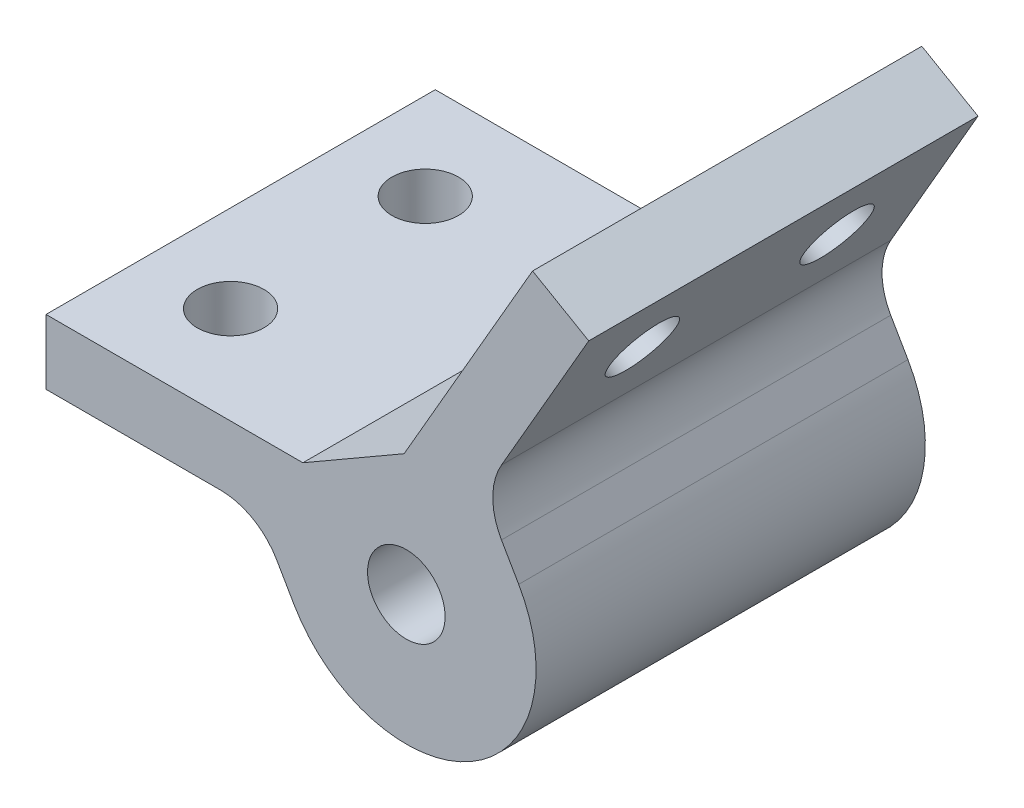
ISO-10303-21;
HEADER;
FILE_DESCRIPTION(('STEP AP214'),'2;1');
FILE_NAME('part.step','',(''),(''),'','','');
FILE_SCHEMA(('AUTOMOTIVE_DESIGN { 1 0 10303 214 1 1 1 1 }'));
ENDSEC;
DATA;
#1=APPLICATION_CONTEXT('core data for automotive mechanical design processes');
#2=APPLICATION_PROTOCOL_DEFINITION('international standard','automotive_design',2000,#1);
#3=PRODUCT_CONTEXT('',#1,'mechanical');
#4=PRODUCT('Part','Part','',(#3));
#5=PRODUCT_RELATED_PRODUCT_CATEGORY('part','',(#4));
#6=PRODUCT_DEFINITION_FORMATION('','',#4);
#7=PRODUCT_DEFINITION_CONTEXT('part definition',#1,'design');
#8=PRODUCT_DEFINITION('design','',#6,#7);
#9=PRODUCT_DEFINITION_SHAPE('','',#8);
#10=(LENGTH_UNIT() NAMED_UNIT(*) SI_UNIT(.MILLI.,.METRE.));
#11=(NAMED_UNIT(*) PLANE_ANGLE_UNIT() SI_UNIT($,.RADIAN.));
#12=(NAMED_UNIT(*) SI_UNIT($,.STERADIAN.) SOLID_ANGLE_UNIT());
#13=UNCERTAINTY_MEASURE_WITH_UNIT(LENGTH_MEASURE(1.E-05),#10,'distance_accuracy_value','');
#14=(GEOMETRIC_REPRESENTATION_CONTEXT(3) GLOBAL_UNCERTAINTY_ASSIGNED_CONTEXT((#13)) GLOBAL_UNIT_ASSIGNED_CONTEXT((#10,
#11,#12)) REPRESENTATION_CONTEXT('',''));
#15=CARTESIAN_POINT('',(0.,0.,0.));
#16=DIRECTION('',(0.,0.,1.));
#17=DIRECTION('',(1.,0.,0.));
#18=AXIS2_PLACEMENT_3D('',#15,#16,#17);
#19=CARTESIAN_POINT('',(-0.108763620489994,5.90761588329622,19.05));
#20=DIRECTION('',(0.500000000000001,-0.866025403784438,0.));
#21=DIRECTION('',(0.866025403784438,0.500000000000001,0.));
#22=AXIS2_PLACEMENT_3D('',#19,#20,#21);
#23=PLANE('',#22);
#24=DIRECTION('',(-0.866025403784438,-0.500000000000001,0.));
#25=VECTOR('',#24,1.);
#26=CARTESIAN_POINT('',(-0.108763620489994,5.90761588329622,0.));
#27=LINE('',#26,#25);
#28=CARTESIAN_POINT('',(-0.108763620489994,5.90761588329622,0.));
#29=VERTEX_POINT('',#28);
#30=CARTESIAN_POINT('',(-5.06176362048999,3.048,0.));
#31=VERTEX_POINT('',#30);
#32=EDGE_CURVE('E146',#29,#31,#27,.T.);
#33=ORIENTED_EDGE('',*,*,#32,.T.);
#34=DIRECTION('',(0.,0.,-1.));
#35=VECTOR('',#34,1.);
#36=CARTESIAN_POINT('',(-5.06176362048999,3.048,19.05));
#37=LINE('',#36,#35);
#38=CARTESIAN_POINT('',(-5.06176362048999,3.048,19.05));
#39=VERTEX_POINT('',#38);
#40=EDGE_CURVE('E127',#39,#31,#37,.T.);
#41=ORIENTED_EDGE('',*,*,#40,.F.);
#42=DIRECTION('',(-0.866025403784438,-0.500000000000001,0.));
#43=VECTOR('',#42,1.);
#44=CARTESIAN_POINT('',(-0.108763620489994,5.90761588329622,19.05));
#45=LINE('',#44,#43);
#46=CARTESIAN_POINT('',(-0.108763620489994,5.90761588329622,19.05));
#47=VERTEX_POINT('',#46);
#48=EDGE_CURVE('E134',#47,#39,#45,.T.);
#49=ORIENTED_EDGE('',*,*,#48,.F.);
#50=DIRECTION('',(0.,0.,-1.));
#51=VECTOR('',#50,1.);
#52=CARTESIAN_POINT('',(-0.108763620489994,5.90761588329622,19.05));
#53=LINE('',#52,#51);
#54=EDGE_CURVE('E211',#47,#29,#53,.T.);
#55=ORIENTED_EDGE('',*,*,#54,.T.);
#56=EDGE_LOOP('',(#33,#41,#49,#55));
#57=FACE_BOUND('',#56,.T.);
#58=ADVANCED_FACE('F33',(#57),#23,.F.);
#59=CARTESIAN_POINT('',(-5.06176362048999,3.048,19.05));
#60=DIRECTION('',(0.,-1.,0.));
#61=DIRECTION('',(1.,0.,0.));
#62=AXIS2_PLACEMENT_3D('',#59,#60,#61);
#63=PLANE('',#62);
#64=CARTESIAN_POINT('',(-13.3634378298441,3.048,4.7625));
#65=DIRECTION('',(0.,-1.,0.));
#66=DIRECTION('',(1.,0.,0.));
#67=AXIS2_PLACEMENT_3D('',#64,#65,#66);
#68=CIRCLE('',#67,1.63194999999999);
#69=CARTESIAN_POINT('',(-11.7314878298441,3.048,4.7625));
#70=VERTEX_POINT('',#69);
#71=EDGE_CURVE('E269',#70,#70,#68,.T.);
#72=ORIENTED_EDGE('',*,*,#71,.T.);
#73=EDGE_LOOP('',(#72));
#74=FACE_BOUND('',#73,.T.);
#75=CARTESIAN_POINT('',(-13.3634378298441,3.048,14.2875));
#76=DIRECTION('',(0.,-1.,0.));
#77=DIRECTION('',(1.,0.,0.));
#78=AXIS2_PLACEMENT_3D('',#75,#76,#77);
#79=CIRCLE('',#78,1.63194999999999);
#80=CARTESIAN_POINT('',(-11.7314878298441,3.048,14.2875));
#81=VERTEX_POINT('',#80);
#82=EDGE_CURVE('E37',#81,#81,#79,.T.);
#83=ORIENTED_EDGE('',*,*,#82,.T.);
#84=EDGE_LOOP('',(#83));
#85=FACE_BOUND('',#84,.T.);
#86=DIRECTION('',(-1.,0.,0.));
#87=VECTOR('',#86,1.);
#88=CARTESIAN_POINT('',(-5.06176362048999,3.048,0.));
#89=LINE('',#88,#87);
#90=CARTESIAN_POINT('',(-17.63476362049,3.048,0.));
#91=VERTEX_POINT('',#90);
#92=EDGE_CURVE('E199',#31,#91,#89,.T.);
#93=ORIENTED_EDGE('',*,*,#92,.T.);
#94=DIRECTION('',(0.,0.,-1.));
#95=VECTOR('',#94,1.);
#96=CARTESIAN_POINT('',(-17.63476362049,3.048,19.05));
#97=LINE('',#96,#95);
#98=CARTESIAN_POINT('',(-17.63476362049,3.048,19.05));
#99=VERTEX_POINT('',#98);
#100=EDGE_CURVE('E130',#99,#91,#97,.T.);
#101=ORIENTED_EDGE('',*,*,#100,.F.);
#102=DIRECTION('',(-1.,0.,0.));
#103=VECTOR('',#102,1.);
#104=CARTESIAN_POINT('',(-5.06176362048999,3.048,19.05));
#105=LINE('',#104,#103);
#106=EDGE_CURVE('E123',#39,#99,#105,.T.);
#107=ORIENTED_EDGE('',*,*,#106,.F.);
#108=ORIENTED_EDGE('',*,*,#40,.T.);
#109=EDGE_LOOP('',(#93,#101,#107,#108));
#110=FACE_BOUND('',#109,.T.);
#111=ADVANCED_FACE('F125',(#74,#85,#110),#63,.F.);
#112=CARTESIAN_POINT('',(-17.63476362049,3.048,19.05));
#113=DIRECTION('',(1.,0.,0.));
#114=DIRECTION('',(0.,0.,-1.));
#115=AXIS2_PLACEMENT_3D('',#112,#113,#114);
#116=PLANE('',#115);
#117=DIRECTION('',(0.,-1.,0.));
#118=VECTOR('',#117,1.);
#119=CARTESIAN_POINT('',(-17.63476362049,3.048,0.));
#120=LINE('',#119,#118);
#121=CARTESIAN_POINT('',(-17.63476362049,-0.127000000000002,0.));
#122=VERTEX_POINT('',#121);
#123=EDGE_CURVE('E195',#91,#122,#120,.T.);
#124=ORIENTED_EDGE('',*,*,#123,.T.);
#125=DIRECTION('',(0.,0.,-1.));
#126=VECTOR('',#125,1.);
#127=CARTESIAN_POINT('',(-17.63476362049,-0.127000000000002,19.05));
#128=LINE('',#127,#126);
#129=CARTESIAN_POINT('',(-17.63476362049,-0.127000000000002,19.05));
#130=VERTEX_POINT('',#129);
#131=EDGE_CURVE('E152',#130,#122,#128,.T.);
#132=ORIENTED_EDGE('',*,*,#131,.F.);
#133=DIRECTION('',(0.,-1.,0.));
#134=VECTOR('',#133,1.);
#135=CARTESIAN_POINT('',(-17.63476362049,3.048,19.05));
#136=LINE('',#135,#134);
#137=EDGE_CURVE('E133',#99,#130,#136,.T.);
#138=ORIENTED_EDGE('',*,*,#137,.F.);
#139=ORIENTED_EDGE('',*,*,#100,.T.);
#140=EDGE_LOOP('',(#124,#132,#138,#139));
#141=FACE_BOUND('',#140,.T.);
#142=ADVANCED_FACE('F245',(#141),#116,.F.);
#143=CARTESIAN_POINT('',(-17.63476362049,-0.127000000000002,19.05));
#144=DIRECTION('',(0.,1.,0.));
#145=DIRECTION('',(-1.,0.,0.));
#146=AXIS2_PLACEMENT_3D('',#143,#144,#145);
#147=PLANE('',#146);
#148=CARTESIAN_POINT('',(-13.3634378298441,-0.127000000000003,4.7625));
#149=DIRECTION('',(0.,-1.,0.));
#150=DIRECTION('',(0.,0.,-1.));
#151=AXIS2_PLACEMENT_3D('',#148,#149,#150);
#152=CIRCLE('',#151,1.63194999999999);
#153=CARTESIAN_POINT('',(-13.3634378298441,-0.127000000000003,3.13055000000001));
#154=VERTEX_POINT('',#153);
#155=EDGE_CURVE('E272',#154,#154,#152,.T.);
#156=ORIENTED_EDGE('',*,*,#155,.F.);
#157=EDGE_LOOP('',(#156));
#158=FACE_BOUND('',#157,.T.);
#159=CARTESIAN_POINT('',(-13.3634378298441,-0.127000000000003,14.2875));
#160=DIRECTION('',(0.,-1.,0.));
#161=DIRECTION('',(0.,0.,-1.));
#162=AXIS2_PLACEMENT_3D('',#159,#160,#161);
#163=CIRCLE('',#162,1.63194999999999);
#164=CARTESIAN_POINT('',(-13.3634378298441,-0.127000000000003,12.65555));
#165=VERTEX_POINT('',#164);
#166=EDGE_CURVE('E266',#165,#165,#163,.T.);
#167=ORIENTED_EDGE('',*,*,#166,.F.);
#168=EDGE_LOOP('',(#167));
#169=FACE_BOUND('',#168,.T.);
#170=DIRECTION('',(1.,0.,0.));
#171=VECTOR('',#170,1.);
#172=CARTESIAN_POINT('',(-17.63476362049,-0.127000000000002,0.));
#173=LINE('',#172,#171);
#174=CARTESIAN_POINT('',(-9.09211203919823,-0.127000000000001,0.));
#175=VERTEX_POINT('',#174);
#176=EDGE_CURVE('E188',#122,#175,#173,.T.);
#177=ORIENTED_EDGE('',*,*,#176,.T.);
#178=DIRECTION('',(0.,0.,-1.));
#179=VECTOR('',#178,1.);
#180=CARTESIAN_POINT('',(-9.09211203919823,-0.127000000000001,19.05));
#181=LINE('',#180,#179);
#182=CARTESIAN_POINT('',(-9.09211203919823,-0.127000000000001,19.05));
#183=VERTEX_POINT('',#182);
#184=EDGE_CURVE('E150',#175,#183,#181,.F.);
#185=ORIENTED_EDGE('',*,*,#184,.T.);
#186=DIRECTION('',(1.,0.,0.));
#187=VECTOR('',#186,1.);
#188=CARTESIAN_POINT('',(-17.63476362049,-0.127000000000002,19.05));
#189=LINE('',#188,#187);
#190=EDGE_CURVE('E171',#130,#183,#189,.T.);
#191=ORIENTED_EDGE('',*,*,#190,.F.);
#192=ORIENTED_EDGE('',*,*,#131,.T.);
#193=EDGE_LOOP('',(#177,#185,#191,#192));
#194=FACE_BOUND('',#193,.T.);
#195=ADVANCED_FACE('F193',(#158,#169,#194),#147,.F.);
#196=CARTESIAN_POINT('',(-5.49926131403118,-3.17500000000001,19.05));
#197=DIRECTION('',(0.866025403784438,0.500000000000001,0.));
#198=DIRECTION('',(-0.500000000000001,0.866025403784438,0.));
#199=AXIS2_PLACEMENT_3D('',#196,#197,#198);
#200=PLANE('',#199);
#201=DIRECTION('',(0.500000000000001,-0.866025403784438,0.));
#202=VECTOR('',#201,1.);
#203=CARTESIAN_POINT('',(-5.49926131403118,-3.17500000000001,19.05));
#204=LINE('',#203,#202);
#205=CARTESIAN_POINT('',(-6.34248138218264,-1.7145,19.05));
#206=VERTEX_POINT('',#205);
#207=CARTESIAN_POINT('',(-5.49926131403118,-3.17500000000001,19.05));
#208=VERTEX_POINT('',#207);
#209=EDGE_CURVE('E168',#206,#208,#204,.T.);
#210=ORIENTED_EDGE('',*,*,#209,.F.);
#211=DIRECTION('',(0.,0.,-1.));
#212=VECTOR('',#211,1.);
#213=CARTESIAN_POINT('',(-6.34248138218264,-1.7145,0.));
#214=LINE('',#213,#212);
#215=CARTESIAN_POINT('',(-6.34248138218264,-1.7145,0.));
#216=VERTEX_POINT('',#215);
#217=EDGE_CURVE('E147',#206,#216,#214,.T.);
#218=ORIENTED_EDGE('',*,*,#217,.T.);
#219=DIRECTION('',(0.500000000000001,-0.866025403784438,0.));
#220=VECTOR('',#219,1.);
#221=CARTESIAN_POINT('',(-5.49926131403118,-3.17500000000001,0.));
#222=LINE('',#221,#220);
#223=CARTESIAN_POINT('',(-5.49926131403118,-3.17500000000001,0.));
#224=VERTEX_POINT('',#223);
#225=EDGE_CURVE('E190',#216,#224,#222,.T.);
#226=ORIENTED_EDGE('',*,*,#225,.T.);
#227=DIRECTION('',(0.,0.,-1.));
#228=VECTOR('',#227,1.);
#229=CARTESIAN_POINT('',(-5.49926131403118,-3.17500000000001,19.05));
#230=LINE('',#229,#228);
#231=EDGE_CURVE('E179',#208,#224,#230,.T.);
#232=ORIENTED_EDGE('',*,*,#231,.F.);
#233=EDGE_LOOP('',(#210,#218,#226,#232));
#234=FACE_BOUND('',#233,.T.);
#235=ADVANCED_FACE('F176',(#234),#200,.F.);
#236=CARTESIAN_POINT('',(0.,0.,19.05));
#237=DIRECTION('',(0.,0.,-1.));
#238=DIRECTION('',(-1.,0.,0.));
#239=AXIS2_PLACEMENT_3D('',#236,#237,#238);
#240=CYLINDRICAL_SURFACE('',#239,6.35);
#241=CARTESIAN_POINT('',(0.,0.,0.));
#242=DIRECTION('',(0.,0.,1.));
#243=DIRECTION('',(1.,0.,0.));
#244=AXIS2_PLACEMENT_3D('',#241,#242,#243);
#245=CIRCLE('',#244,6.35);
#246=CARTESIAN_POINT('',(5.49926131403118,3.17500000000001,0.));
#247=VERTEX_POINT('',#246);
#248=EDGE_CURVE('E197',#224,#247,#245,.T.);
#249=ORIENTED_EDGE('',*,*,#248,.T.);
#250=DIRECTION('',(0.,0.,-1.));
#251=VECTOR('',#250,1.);
#252=CARTESIAN_POINT('',(5.49926131403118,3.17500000000001,19.05));
#253=LINE('',#252,#251);
#254=CARTESIAN_POINT('',(5.49926131403118,3.17500000000001,19.05));
#255=VERTEX_POINT('',#254);
#256=EDGE_CURVE('E219',#255,#247,#253,.T.);
#257=ORIENTED_EDGE('',*,*,#256,.F.);
#258=CARTESIAN_POINT('',(0.,0.,19.05));
#259=DIRECTION('',(0.,0.,1.));
#260=DIRECTION('',(1.,0.,0.));
#261=AXIS2_PLACEMENT_3D('',#258,#259,#260);
#262=CIRCLE('',#261,6.35);
#263=EDGE_CURVE('E181',#208,#255,#262,.T.);
#264=ORIENTED_EDGE('',*,*,#263,.F.);
#265=ORIENTED_EDGE('',*,*,#231,.T.);
#266=EDGE_LOOP('',(#249,#257,#264,#265));
#267=FACE_BOUND('',#266,.T.);
#268=ADVANCED_FACE('F223',(#267),#240,.T.);
#269=CARTESIAN_POINT('',(5.49926131403118,3.17500000000001,19.05));
#270=DIRECTION('',(-0.866025403784438,-0.500000000000001,0.));
#271=DIRECTION('',(0.500000000000001,-0.866025403784438,0.));
#272=AXIS2_PLACEMENT_3D('',#269,#270,#271);
#273=PLANE('',#272);
#274=DIRECTION('',(-0.500000000000001,0.866025403784438,0.));
#275=VECTOR('',#274,1.);
#276=CARTESIAN_POINT('',(5.49926131403118,3.17500000000001,0.));
#277=LINE('',#276,#275);
#278=CARTESIAN_POINT('',(4.65604124587972,4.63550000000002,0.));
#279=VERTEX_POINT('',#278);
#280=EDGE_CURVE('E204',#247,#279,#277,.T.);
#281=ORIENTED_EDGE('',*,*,#280,.T.);
#282=DIRECTION('',(0.,0.,-1.));
#283=VECTOR('',#282,1.);
#284=CARTESIAN_POINT('',(4.65604124587972,4.63550000000002,19.05));
#285=LINE('',#284,#283);
#286=CARTESIAN_POINT('',(4.65604124587972,4.63550000000002,19.05));
#287=VERTEX_POINT('',#286);
#288=EDGE_CURVE('E49',#279,#287,#285,.F.);
#289=ORIENTED_EDGE('',*,*,#288,.T.);
#290=DIRECTION('',(-0.500000000000001,0.866025403784438,0.));
#291=VECTOR('',#290,1.);
#292=CARTESIAN_POINT('',(5.49926131403118,3.17500000000001,19.05));
#293=LINE('',#292,#291);
#294=EDGE_CURVE('E232',#255,#287,#293,.T.);
#295=ORIENTED_EDGE('',*,*,#294,.F.);
#296=ORIENTED_EDGE('',*,*,#256,.T.);
#297=EDGE_LOOP('',(#281,#289,#295,#296));
#298=FACE_BOUND('',#297,.T.);
#299=ADVANCED_FACE('F225',(#298),#273,.F.);
#300=CARTESIAN_POINT('',(8.92736703652557,15.208653285078,19.05));
#301=DIRECTION('',(-0.86602540378444,0.499999999999997,0.));
#302=DIRECTION('',(-0.499999999999997,-0.86602540378444,0.));
#303=AXIS2_PLACEMENT_3D('',#300,#301,#302);
#304=PLANE('',#303);
#305=CARTESIAN_POINT('',(6.79170414120265,11.509576642539,14.2875));
#306=DIRECTION('',(0.86602540378444,-0.499999999999998,0.));
#307=DIRECTION('',(0.499999999999998,0.86602540378444,0.));
#308=AXIS2_PLACEMENT_3D('',#305,#306,#307);
#309=CIRCLE('',#308,1.63194999999999);
#310=CARTESIAN_POINT('',(7.60767914120265,12.922886800245,14.2875));
#311=VERTEX_POINT('',#310);
#312=EDGE_CURVE('E263',#311,#311,#309,.T.);
#313=ORIENTED_EDGE('',*,*,#312,.F.);
#314=EDGE_LOOP('',(#313));
#315=FACE_BOUND('',#314,.T.);
#316=CARTESIAN_POINT('',(6.79170414120266,11.509576642539,4.7625));
#317=DIRECTION('',(0.86602540378444,-0.499999999999998,0.));
#318=DIRECTION('',(0.499999999999998,0.86602540378444,0.));
#319=AXIS2_PLACEMENT_3D('',#316,#317,#318);
#320=CIRCLE('',#319,1.63194999999999);
#321=CARTESIAN_POINT('',(7.60767914120265,12.922886800245,4.7625));
#322=VERTEX_POINT('',#321);
#323=EDGE_CURVE('E257',#322,#322,#320,.T.);
#324=ORIENTED_EDGE('',*,*,#323,.F.);
#325=EDGE_LOOP('',(#324));
#326=FACE_BOUND('',#325,.T.);
#327=DIRECTION('',(0.499999999999997,0.86602540378444,0.));
#328=VECTOR('',#327,1.);
#329=CARTESIAN_POINT('',(8.92736703652557,15.208653285078,19.05));
#330=LINE('',#329,#328);
#331=CARTESIAN_POINT('',(4.65604124587972,7.81050000000001,19.05));
#332=VERTEX_POINT('',#331);
#333=CARTESIAN_POINT('',(8.92736703652557,15.208653285078,19.05));
#334=VERTEX_POINT('',#333);
#335=EDGE_CURVE('E230',#332,#334,#330,.T.);
#336=ORIENTED_EDGE('',*,*,#335,.F.);
#337=DIRECTION('',(0.,0.,-1.));
#338=VECTOR('',#337,1.);
#339=CARTESIAN_POINT('',(4.65604124587972,7.81050000000001,0.));
#340=LINE('',#339,#338);
#341=CARTESIAN_POINT('',(4.65604124587972,7.81050000000001,0.));
#342=VERTEX_POINT('',#341);
#343=EDGE_CURVE('E157',#332,#342,#340,.T.);
#344=ORIENTED_EDGE('',*,*,#343,.T.);
#345=DIRECTION('',(0.499999999999997,0.86602540378444,0.));
#346=VECTOR('',#345,1.);
#347=CARTESIAN_POINT('',(8.92736703652557,15.208653285078,0.));
#348=LINE('',#347,#346);
#349=CARTESIAN_POINT('',(8.92736703652557,15.208653285078,0.));
#350=VERTEX_POINT('',#349);
#351=EDGE_CURVE('E206',#342,#350,#348,.T.);
#352=ORIENTED_EDGE('',*,*,#351,.T.);
#353=DIRECTION('',(0.,0.,-1.));
#354=VECTOR('',#353,1.);
#355=CARTESIAN_POINT('',(8.92736703652557,15.208653285078,19.05));
#356=LINE('',#355,#354);
#357=EDGE_CURVE('E216',#334,#350,#356,.T.);
#358=ORIENTED_EDGE('',*,*,#357,.F.);
#359=EDGE_LOOP('',(#336,#344,#352,#358));
#360=FACE_BOUND('',#359,.T.);
#361=ADVANCED_FACE('F234',(#315,#326,#360),#304,.F.);
#362=CARTESIAN_POINT('',(6.17773637950998,16.796153285078,19.05));
#363=DIRECTION('',(-0.499999999999996,-0.866025403784441,0.));
#364=DIRECTION('',(0.866025403784441,-0.499999999999996,0.));
#365=AXIS2_PLACEMENT_3D('',#362,#363,#364);
#366=PLANE('',#365);
#367=DIRECTION('',(-0.866025403784441,0.499999999999997,0.));
#368=VECTOR('',#367,1.);
#369=CARTESIAN_POINT('',(6.17773637950998,16.796153285078,0.));
#370=LINE('',#369,#368);
#371=CARTESIAN_POINT('',(6.17773637950998,16.796153285078,0.));
#372=VERTEX_POINT('',#371);
#373=EDGE_CURVE('E208',#350,#372,#370,.T.);
#374=ORIENTED_EDGE('',*,*,#373,.T.);
#375=DIRECTION('',(0.,0.,-1.));
#376=VECTOR('',#375,1.);
#377=CARTESIAN_POINT('',(6.17773637950998,16.796153285078,19.05));
#378=LINE('',#377,#376);
#379=CARTESIAN_POINT('',(6.17773637950998,16.796153285078,19.05));
#380=VERTEX_POINT('',#379);
#381=EDGE_CURVE('E213',#380,#372,#378,.T.);
#382=ORIENTED_EDGE('',*,*,#381,.F.);
#383=DIRECTION('',(-0.866025403784441,0.499999999999997,0.));
#384=VECTOR('',#383,1.);
#385=CARTESIAN_POINT('',(6.17773637950998,16.796153285078,19.05));
#386=LINE('',#385,#384);
#387=EDGE_CURVE('E236',#334,#380,#386,.T.);
#388=ORIENTED_EDGE('',*,*,#387,.F.);
#389=ORIENTED_EDGE('',*,*,#357,.T.);
#390=EDGE_LOOP('',(#374,#382,#388,#389));
#391=FACE_BOUND('',#390,.T.);
#392=ADVANCED_FACE('F326',(#391),#366,.F.);
#393=CARTESIAN_POINT('',(-0.108763620489994,5.90761588329622,19.05));
#394=DIRECTION('',(0.86602540378444,-0.499999999999998,0.));
#395=DIRECTION('',(0.499999999999998,0.86602540378444,0.));
#396=AXIS2_PLACEMENT_3D('',#393,#394,#395);
#397=PLANE('',#396);
#398=CARTESIAN_POINT('',(4.04207348418705,13.097076642539,14.2875));
#399=DIRECTION('',(0.86602540378444,-0.499999999999998,0.));
#400=DIRECTION('',(0.499999999999998,0.86602540378444,0.));
#401=AXIS2_PLACEMENT_3D('',#398,#399,#400);
#402=CIRCLE('',#401,1.63194999999999);
#403=CARTESIAN_POINT('',(4.85804848418704,14.510386800245,14.2875));
#404=VERTEX_POINT('',#403);
#405=EDGE_CURVE('E260',#404,#404,#402,.T.);
#406=ORIENTED_EDGE('',*,*,#405,.T.);
#407=EDGE_LOOP('',(#406));
#408=FACE_BOUND('',#407,.T.);
#409=CARTESIAN_POINT('',(4.04207348418705,13.097076642539,4.7625));
#410=DIRECTION('',(0.86602540378444,-0.499999999999998,0.));
#411=DIRECTION('',(0.499999999999998,0.86602540378444,0.));
#412=AXIS2_PLACEMENT_3D('',#409,#410,#411);
#413=CIRCLE('',#412,1.63194999999999);
#414=CARTESIAN_POINT('',(4.85804848418704,14.510386800245,4.7625));
#415=VERTEX_POINT('',#414);
#416=EDGE_CURVE('E254',#415,#415,#413,.T.);
#417=ORIENTED_EDGE('',*,*,#416,.T.);
#418=EDGE_LOOP('',(#417));
#419=FACE_BOUND('',#418,.T.);
#420=DIRECTION('',(-0.499999999999998,-0.86602540378444,0.));
#421=VECTOR('',#420,1.);
#422=CARTESIAN_POINT('',(-0.108763620489994,5.90761588329622,0.));
#423=LINE('',#422,#421);
#424=EDGE_CURVE('E143',#372,#29,#423,.T.);
#425=ORIENTED_EDGE('',*,*,#424,.T.);
#426=ORIENTED_EDGE('',*,*,#54,.F.);
#427=DIRECTION('',(-0.499999999999998,-0.86602540378444,0.));
#428=VECTOR('',#427,1.);
#429=CARTESIAN_POINT('',(-0.108763620489994,5.90761588329622,19.05));
#430=LINE('',#429,#428);
#431=EDGE_CURVE('E139',#380,#47,#430,.T.);
#432=ORIENTED_EDGE('',*,*,#431,.F.);
#433=ORIENTED_EDGE('',*,*,#381,.T.);
#434=EDGE_LOOP('',(#425,#426,#432,#433));
#435=FACE_BOUND('',#434,.T.);
#436=ADVANCED_FACE('F321',(#408,#419,#435),#397,.F.);
#437=CARTESIAN_POINT('',(0.,0.,19.05));
#438=DIRECTION('',(0.,0.,1.));
#439=DIRECTION('',(1.,0.,0.));
#440=AXIS2_PLACEMENT_3D('',#437,#438,#439);
#441=PLANE('',#440);
#442=CARTESIAN_POINT('',(0.,0.,19.05));
#443=DIRECTION('',(0.,0.,-1.));
#444=DIRECTION('',(-1.,0.,0.));
#445=AXIS2_PLACEMENT_3D('',#442,#443,#444);
#446=CIRCLE('',#445,1.89865);
#447=CARTESIAN_POINT('',(-1.89865,0.,19.05));
#448=VERTEX_POINT('',#447);
#449=EDGE_CURVE('E243',#448,#448,#446,.T.);
#450=ORIENTED_EDGE('',*,*,#449,.T.);
#451=EDGE_LOOP('',(#450));
#452=FACE_BOUND('',#451,.T.);
#453=ORIENTED_EDGE('',*,*,#48,.T.);
#454=ORIENTED_EDGE('',*,*,#106,.T.);
#455=ORIENTED_EDGE('',*,*,#137,.T.);
#456=ORIENTED_EDGE('',*,*,#190,.T.);
#457=CARTESIAN_POINT('',(-9.09211203919823,-3.302,19.05));
#458=DIRECTION('',(0.,0.,1.));
#459=DIRECTION('',(1.,0.,0.));
#460=AXIS2_PLACEMENT_3D('',#457,#458,#459);
#461=CIRCLE('',#460,3.175);
#462=EDGE_CURVE('E163',#183,#206,#461,.F.);
#463=ORIENTED_EDGE('',*,*,#462,.T.);
#464=ORIENTED_EDGE('',*,*,#209,.T.);
#465=ORIENTED_EDGE('',*,*,#263,.T.);
#466=ORIENTED_EDGE('',*,*,#294,.T.);
#467=CARTESIAN_POINT('',(7.40567190289531,6.22300000000002,19.05));
#468=DIRECTION('',(0.,0.,1.));
#469=DIRECTION('',(1.,0.,0.));
#470=AXIS2_PLACEMENT_3D('',#467,#468,#469);
#471=CIRCLE('',#470,3.175);
#472=EDGE_CURVE('E11',#287,#332,#471,.F.);
#473=ORIENTED_EDGE('',*,*,#472,.T.);
#474=ORIENTED_EDGE('',*,*,#335,.T.);
#475=ORIENTED_EDGE('',*,*,#387,.T.);
#476=ORIENTED_EDGE('',*,*,#431,.T.);
#477=EDGE_LOOP('',(#453,#454,#455,#456,#463,#464,#465,#466,#473,#474,#475,#476));
#478=FACE_BOUND('',#477,.T.);
#479=ADVANCED_FACE('F137',(#452,#478),#441,.T.);
#480=CARTESIAN_POINT('',(0.,0.,0.));
#481=DIRECTION('',(0.,0.,1.));
#482=DIRECTION('',(1.,0.,0.));
#483=AXIS2_PLACEMENT_3D('',#480,#481,#482);
#484=PLANE('',#483);
#485=CARTESIAN_POINT('',(0.,0.,0.));
#486=DIRECTION('',(0.,0.,-1.));
#487=DIRECTION('',(-1.,0.,0.));
#488=AXIS2_PLACEMENT_3D('',#485,#486,#487);
#489=CIRCLE('',#488,1.89865);
#490=CARTESIAN_POINT('',(-1.89865,0.,0.));
#491=VERTEX_POINT('',#490);
#492=EDGE_CURVE('E251',#491,#491,#489,.T.);
#493=ORIENTED_EDGE('',*,*,#492,.F.);
#494=EDGE_LOOP('',(#493));
#495=FACE_BOUND('',#494,.T.);
#496=ORIENTED_EDGE('',*,*,#32,.F.);
#497=ORIENTED_EDGE('',*,*,#424,.F.);
#498=ORIENTED_EDGE('',*,*,#373,.F.);
#499=ORIENTED_EDGE('',*,*,#351,.F.);
#500=CARTESIAN_POINT('',(7.40567190289531,6.22300000000002,0.));
#501=DIRECTION('',(0.,0.,1.));
#502=DIRECTION('',(1.,0.,0.));
#503=AXIS2_PLACEMENT_3D('',#500,#501,#502);
#504=CIRCLE('',#503,3.175);
#505=EDGE_CURVE('E42',#342,#279,#504,.T.);
#506=ORIENTED_EDGE('',*,*,#505,.T.);
#507=ORIENTED_EDGE('',*,*,#280,.F.);
#508=ORIENTED_EDGE('',*,*,#248,.F.);
#509=ORIENTED_EDGE('',*,*,#225,.F.);
#510=CARTESIAN_POINT('',(-9.09211203919823,-3.302,0.));
#511=DIRECTION('',(0.,0.,1.));
#512=DIRECTION('',(1.,0.,0.));
#513=AXIS2_PLACEMENT_3D('',#510,#511,#512);
#514=CIRCLE('',#513,3.175);
#515=EDGE_CURVE('E161',#216,#175,#514,.T.);
#516=ORIENTED_EDGE('',*,*,#515,.T.);
#517=ORIENTED_EDGE('',*,*,#176,.F.);
#518=ORIENTED_EDGE('',*,*,#123,.F.);
#519=ORIENTED_EDGE('',*,*,#92,.F.);
#520=EDGE_LOOP('',(#496,#497,#498,#499,#506,#507,#508,#509,#516,#517,#518,#519));
#521=FACE_BOUND('',#520,.T.);
#522=ADVANCED_FACE('F186',(#495,#521),#484,.F.);
#523=CARTESIAN_POINT('',(0.,0.,0.));
#524=DIRECTION('',(0.,0.,-1.));
#525=DIRECTION('',(-1.,0.,0.));
#526=AXIS2_PLACEMENT_3D('',#523,#524,#525);
#527=CYLINDRICAL_SURFACE('',#526,1.89865);
#528=ORIENTED_EDGE('',*,*,#449,.F.);
#529=EDGE_LOOP('',(#528));
#530=FACE_BOUND('',#529,.T.);
#531=ORIENTED_EDGE('',*,*,#492,.T.);
#532=EDGE_LOOP('',(#531));
#533=FACE_BOUND('',#532,.T.);
#534=ADVANCED_FACE('F302',(#530,#533),#527,.F.);
#535=CARTESIAN_POINT('',(-9.09211203919823,-3.302,19.05));
#536=DIRECTION('',(0.,0.,1.));
#537=DIRECTION('',(1.,0.,0.));
#538=AXIS2_PLACEMENT_3D('',#535,#536,#537);
#539=CYLINDRICAL_SURFACE('',#538,3.175);
#540=ORIENTED_EDGE('',*,*,#462,.F.);
#541=ORIENTED_EDGE('',*,*,#184,.F.);
#542=ORIENTED_EDGE('',*,*,#515,.F.);
#543=ORIENTED_EDGE('',*,*,#217,.F.);
#544=EDGE_LOOP('',(#540,#541,#542,#543));
#545=FACE_BOUND('',#544,.T.);
#546=ADVANCED_FACE('F183',(#545),#539,.F.);
#547=CARTESIAN_POINT('',(7.40567190289531,6.22300000000002,19.05));
#548=DIRECTION('',(0.,0.,1.));
#549=DIRECTION('',(1.,0.,0.));
#550=AXIS2_PLACEMENT_3D('',#547,#548,#549);
#551=CYLINDRICAL_SURFACE('',#550,3.175);
#552=ORIENTED_EDGE('',*,*,#472,.F.);
#553=ORIENTED_EDGE('',*,*,#288,.F.);
#554=ORIENTED_EDGE('',*,*,#505,.F.);
#555=ORIENTED_EDGE('',*,*,#343,.F.);
#556=EDGE_LOOP('',(#552,#553,#554,#555));
#557=FACE_BOUND('',#556,.T.);
#558=ADVANCED_FACE('F35',(#557),#551,.F.);
#559=CARTESIAN_POINT('',(6.79170414120265,11.509576642539,4.7625));
#560=DIRECTION('',(0.86602540378444,-0.499999999999998,0.));
#561=DIRECTION('',(0.499999999999998,0.86602540378444,0.));
#562=AXIS2_PLACEMENT_3D('',#559,#560,#561);
#563=CYLINDRICAL_SURFACE('',#562,1.63194999999999);
#564=ORIENTED_EDGE('',*,*,#323,.T.);
#565=EDGE_LOOP('',(#564));
#566=FACE_BOUND('',#565,.T.);
#567=ORIENTED_EDGE('',*,*,#416,.F.);
#568=EDGE_LOOP('',(#567));
#569=FACE_BOUND('',#568,.T.);
#570=ADVANCED_FACE('F307',(#566,#569),#563,.F.);
#571=CARTESIAN_POINT('',(6.79170414120265,11.509576642539,14.2875));
#572=DIRECTION('',(0.86602540378444,-0.499999999999998,0.));
#573=DIRECTION('',(0.499999999999998,0.86602540378444,0.));
#574=AXIS2_PLACEMENT_3D('',#571,#572,#573);
#575=CYLINDRICAL_SURFACE('',#574,1.63194999999999);
#576=ORIENTED_EDGE('',*,*,#312,.T.);
#577=EDGE_LOOP('',(#576));
#578=FACE_BOUND('',#577,.T.);
#579=ORIENTED_EDGE('',*,*,#405,.F.);
#580=EDGE_LOOP('',(#579));
#581=FACE_BOUND('',#580,.T.);
#582=ADVANCED_FACE('F287',(#578,#581),#575,.F.);
#583=CARTESIAN_POINT('',(-13.3634378298441,-0.127000000000001,14.2875));
#584=DIRECTION('',(0.,-1.,0.));
#585=DIRECTION('',(0.,0.,-1.));
#586=AXIS2_PLACEMENT_3D('',#583,#584,#585);
#587=CYLINDRICAL_SURFACE('',#586,1.63194999999999);
#588=ORIENTED_EDGE('',*,*,#166,.T.);
#589=EDGE_LOOP('',(#588));
#590=FACE_BOUND('',#589,.T.);
#591=ORIENTED_EDGE('',*,*,#82,.F.);
#592=EDGE_LOOP('',(#591));
#593=FACE_BOUND('',#592,.T.);
#594=ADVANCED_FACE('F284',(#590,#593),#587,.F.);
#595=CARTESIAN_POINT('',(-13.3634378298441,-0.127000000000001,4.7625));
#596=DIRECTION('',(0.,-1.,0.));
#597=DIRECTION('',(0.,0.,-1.));
#598=AXIS2_PLACEMENT_3D('',#595,#596,#597);
#599=CYLINDRICAL_SURFACE('',#598,1.63194999999999);
#600=ORIENTED_EDGE('',*,*,#155,.T.);
#601=EDGE_LOOP('',(#600));
#602=FACE_BOUND('',#601,.T.);
#603=ORIENTED_EDGE('',*,*,#71,.F.);
#604=EDGE_LOOP('',(#603));
#605=FACE_BOUND('',#604,.T.);
#606=ADVANCED_FACE('F276',(#602,#605),#599,.F.);
#607=CLOSED_SHELL('',(#58,#111,#142,#195,#235,#268,#299,#361,#392,#436,#479,#522,#534,#546,#558,
#570,#582,#594,#606));
#608=MANIFOLD_SOLID_BREP('B2',#607);
#609=ADVANCED_BREP_SHAPE_REPRESENTATION('',(#18,#608),#14);
#610=SHAPE_DEFINITION_REPRESENTATION(#9,#609);
ENDSEC;
END-ISO-10303-21;
